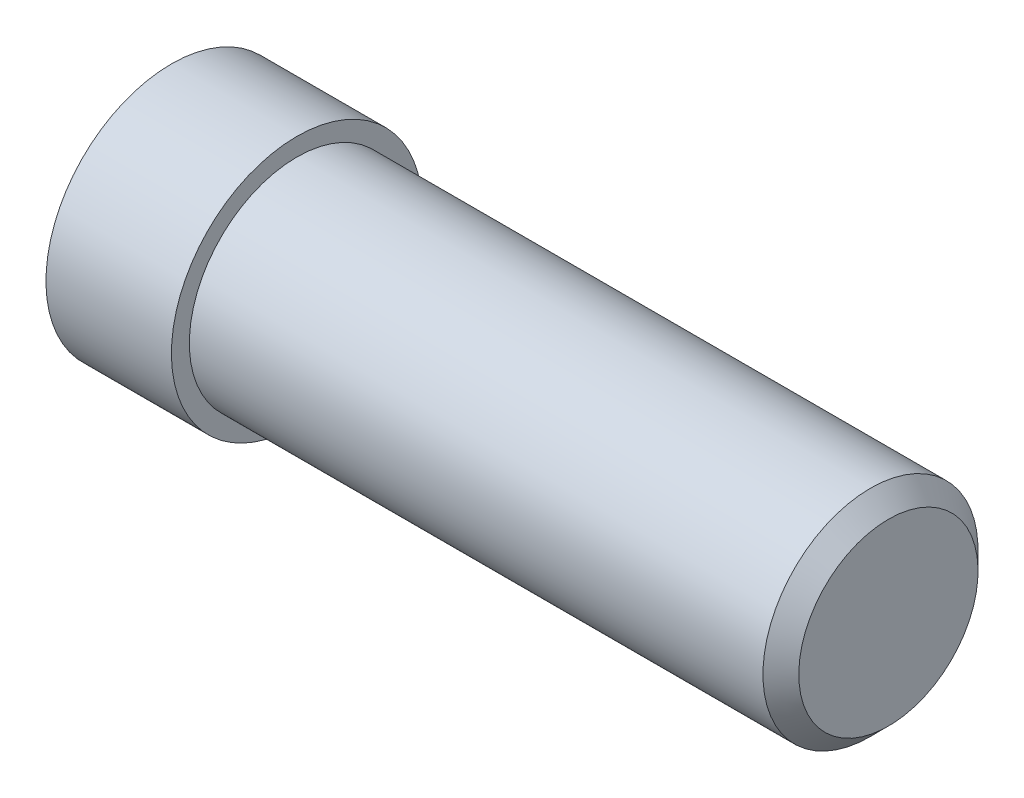
ISO-10303-21;
HEADER;
FILE_DESCRIPTION(('STEP AP214'),'2;1');
FILE_NAME('part.step','',(''),(''),'','','');
FILE_SCHEMA(('AUTOMOTIVE_DESIGN { 1 0 10303 214 1 1 1 1 }'));
ENDSEC;
DATA;
#1=APPLICATION_CONTEXT('core data for automotive mechanical design processes');
#2=APPLICATION_PROTOCOL_DEFINITION('international standard','automotive_design',2000,#1);
#3=PRODUCT_CONTEXT('',#1,'mechanical');
#4=PRODUCT('Part','Part','',(#3));
#5=PRODUCT_RELATED_PRODUCT_CATEGORY('part','',(#4));
#6=PRODUCT_DEFINITION_FORMATION('','',#4);
#7=PRODUCT_DEFINITION_CONTEXT('part definition',#1,'design');
#8=PRODUCT_DEFINITION('design','',#6,#7);
#9=PRODUCT_DEFINITION_SHAPE('','',#8);
#10=(LENGTH_UNIT() NAMED_UNIT(*) SI_UNIT(.MILLI.,.METRE.));
#11=(NAMED_UNIT(*) PLANE_ANGLE_UNIT() SI_UNIT($,.RADIAN.));
#12=(NAMED_UNIT(*) SI_UNIT($,.STERADIAN.) SOLID_ANGLE_UNIT());
#13=UNCERTAINTY_MEASURE_WITH_UNIT(LENGTH_MEASURE(1.E-05),#10,'distance_accuracy_value','');
#14=(GEOMETRIC_REPRESENTATION_CONTEXT(3) GLOBAL_UNCERTAINTY_ASSIGNED_CONTEXT((#13)) GLOBAL_UNIT_ASSIGNED_CONTEXT((#10,
#11,#12)) REPRESENTATION_CONTEXT('',''));
#15=CARTESIAN_POINT('',(0.,0.,0.));
#16=DIRECTION('',(0.,0.,1.));
#17=DIRECTION('',(1.,0.,0.));
#18=AXIS2_PLACEMENT_3D('',#15,#16,#17);
#19=CARTESIAN_POINT('',(0.,6.,0.));
#20=DIRECTION('',(1.,0.,0.));
#21=DIRECTION('',(0.,1.,0.));
#22=AXIS2_PLACEMENT_3D('',#19,#20,#21);
#23=PLANE('',#22);
#24=CARTESIAN_POINT('',(0.,0.,0.));
#25=DIRECTION('',(1.,0.,0.));
#26=DIRECTION('',(0.,1.,0.));
#27=AXIS2_PLACEMENT_3D('',#24,#25,#26);
#28=CIRCLE('',#27,5.);
#29=CARTESIAN_POINT('',(0.,5.,0.));
#30=VERTEX_POINT('',#29);
#31=EDGE_CURVE('E54',#30,#30,#28,.T.);
#32=ORIENTED_EDGE('',*,*,#31,.T.);
#33=EDGE_LOOP('',(#32));
#34=FACE_BOUND('',#33,.T.);
#35=ADVANCED_FACE('F45',(#34),#23,.T.);
#36=CARTESIAN_POINT('',(-40.,0.,0.));
#37=DIRECTION('',(-1.,0.,0.));
#38=DIRECTION('',(0.,-1.,0.));
#39=AXIS2_PLACEMENT_3D('',#36,#37,#38);
#40=PLANE('',#39);
#41=CARTESIAN_POINT('',(-40.,0.,0.));
#42=DIRECTION('',(1.,0.,0.));
#43=DIRECTION('',(0.,1.,0.));
#44=AXIS2_PLACEMENT_3D('',#41,#42,#43);
#45=CIRCLE('',#44,7.);
#46=CARTESIAN_POINT('',(-40.,7.,0.));
#47=VERTEX_POINT('',#46);
#48=EDGE_CURVE('E59',#47,#47,#45,.T.);
#49=ORIENTED_EDGE('',*,*,#48,.F.);
#50=EDGE_LOOP('',(#49));
#51=FACE_BOUND('',#50,.T.);
#52=ADVANCED_FACE('F88',(#51),#40,.T.);
#53=CARTESIAN_POINT('',(0.,0.,0.));
#54=DIRECTION('',(1.,0.,0.));
#55=DIRECTION('',(0.,1.,0.));
#56=AXIS2_PLACEMENT_3D('',#53,#54,#55);
#57=CYLINDRICAL_SURFACE('',#56,7.);
#58=ORIENTED_EDGE('',*,*,#48,.T.);
#59=EDGE_LOOP('',(#58));
#60=FACE_BOUND('',#59,.T.);
#61=CARTESIAN_POINT('',(-33.,0.,0.));
#62=DIRECTION('',(1.,0.,0.));
#63=DIRECTION('',(0.,1.,0.));
#64=AXIS2_PLACEMENT_3D('',#61,#62,#63);
#65=CIRCLE('',#64,7.);
#66=CARTESIAN_POINT('',(-33.,7.,0.));
#67=VERTEX_POINT('',#66);
#68=EDGE_CURVE('E64',#67,#67,#65,.T.);
#69=ORIENTED_EDGE('',*,*,#68,.F.);
#70=EDGE_LOOP('',(#69));
#71=FACE_BOUND('',#70,.T.);
#72=ADVANCED_FACE('F79',(#60,#71),#57,.T.);
#73=CARTESIAN_POINT('',(-33.,7.,0.));
#74=DIRECTION('',(1.,0.,0.));
#75=DIRECTION('',(0.,1.,0.));
#76=AXIS2_PLACEMENT_3D('',#73,#74,#75);
#77=PLANE('',#76);
#78=ORIENTED_EDGE('',*,*,#68,.T.);
#79=EDGE_LOOP('',(#78));
#80=FACE_BOUND('',#79,.T.);
#81=CARTESIAN_POINT('',(-33.,0.,0.));
#82=DIRECTION('',(1.,0.,0.));
#83=DIRECTION('',(0.,1.,0.));
#84=AXIS2_PLACEMENT_3D('',#81,#82,#83);
#85=CIRCLE('',#84,6.);
#86=CARTESIAN_POINT('',(-33.,6.,0.));
#87=VERTEX_POINT('',#86);
#88=EDGE_CURVE('E70',#87,#87,#85,.T.);
#89=ORIENTED_EDGE('',*,*,#88,.F.);
#90=EDGE_LOOP('',(#89));
#91=FACE_BOUND('',#90,.T.);
#92=ADVANCED_FACE('F77',(#80,#91),#77,.T.);
#93=CARTESIAN_POINT('',(0.,0.,0.));
#94=DIRECTION('',(1.,0.,0.));
#95=DIRECTION('',(0.,1.,0.));
#96=AXIS2_PLACEMENT_3D('',#93,#94,#95);
#97=CYLINDRICAL_SURFACE('',#96,6.);
#98=CARTESIAN_POINT('',(-0.999999999999999,0.,0.));
#99=DIRECTION('',(1.,0.,0.));
#100=DIRECTION('',(0.,1.,0.));
#101=AXIS2_PLACEMENT_3D('',#98,#99,#100);
#102=CIRCLE('',#101,6.);
#103=CARTESIAN_POINT('',(-0.999999999999999,6.,0.));
#104=VERTEX_POINT('',#103);
#105=EDGE_CURVE('E10',#104,#104,#102,.F.);
#106=ORIENTED_EDGE('',*,*,#105,.T.);
#107=EDGE_LOOP('',(#106));
#108=FACE_BOUND('',#107,.T.);
#109=ORIENTED_EDGE('',*,*,#88,.T.);
#110=EDGE_LOOP('',(#109));
#111=FACE_BOUND('',#110,.T.);
#112=ADVANCED_FACE('F75',(#108,#111),#97,.T.);
#113=CARTESIAN_POINT('',(0.,0.,0.));
#114=DIRECTION('',(-1.,0.,0.));
#115=DIRECTION('',(0.,-1.,0.));
#116=AXIS2_PLACEMENT_3D('',#113,#114,#115);
#117=CONICAL_SURFACE('',#116,5.,0.785398163397448);
#118=ORIENTED_EDGE('',*,*,#105,.F.);
#119=EDGE_LOOP('',(#118));
#120=FACE_BOUND('',#119,.T.);
#121=ORIENTED_EDGE('',*,*,#31,.F.);
#122=EDGE_LOOP('',(#121));
#123=FACE_BOUND('',#122,.T.);
#124=ADVANCED_FACE('F48',(#120,#123),#117,.T.);
#125=CLOSED_SHELL('',(#35,#52,#72,#92,#112,#124));
#126=MANIFOLD_SOLID_BREP('B2',#125);
#127=ADVANCED_BREP_SHAPE_REPRESENTATION('',(#18,#126),#14);
#128=SHAPE_DEFINITION_REPRESENTATION(#9,#127);
ENDSEC;
END-ISO-10303-21;
